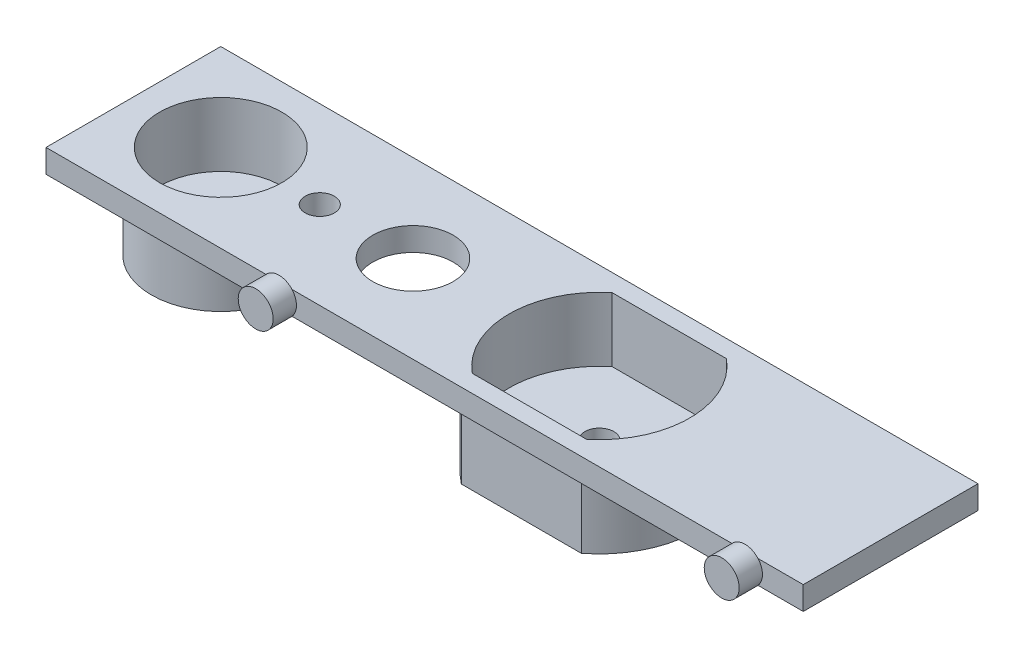
ISO-10303-21;
HEADER;
FILE_DESCRIPTION(('STEP AP214'),'2;1');
FILE_NAME('part.step','',(''),(''),'','','');
FILE_SCHEMA(('AUTOMOTIVE_DESIGN { 1 0 10303 214 1 1 1 1 }'));
ENDSEC;
DATA;
#1=APPLICATION_CONTEXT('core data for automotive mechanical design processes');
#2=APPLICATION_PROTOCOL_DEFINITION('international standard','automotive_design',2000,#1);
#3=PRODUCT_CONTEXT('',#1,'mechanical');
#4=PRODUCT('Part','Part','',(#3));
#5=PRODUCT_RELATED_PRODUCT_CATEGORY('part','',(#4));
#6=PRODUCT_DEFINITION_FORMATION('','',#4);
#7=PRODUCT_DEFINITION_CONTEXT('part definition',#1,'design');
#8=PRODUCT_DEFINITION('design','',#6,#7);
#9=PRODUCT_DEFINITION_SHAPE('','',#8);
#10=(LENGTH_UNIT() NAMED_UNIT(*) SI_UNIT(.MILLI.,.METRE.));
#11=(NAMED_UNIT(*) PLANE_ANGLE_UNIT() SI_UNIT($,.RADIAN.));
#12=(NAMED_UNIT(*) SI_UNIT($,.STERADIAN.) SOLID_ANGLE_UNIT());
#13=UNCERTAINTY_MEASURE_WITH_UNIT(LENGTH_MEASURE(1.E-05),#10,'distance_accuracy_value','');
#14=(GEOMETRIC_REPRESENTATION_CONTEXT(3) GLOBAL_UNCERTAINTY_ASSIGNED_CONTEXT((#13)) GLOBAL_UNIT_ASSIGNED_CONTEXT((#10,
#11,#12)) REPRESENTATION_CONTEXT('',''));
#15=CARTESIAN_POINT('',(0.,0.,0.));
#16=DIRECTION('',(0.,0.,1.));
#17=DIRECTION('',(1.,0.,0.));
#18=AXIS2_PLACEMENT_3D('',#15,#16,#17);
#19=CARTESIAN_POINT('',(0.,2.,0.));
#20=DIRECTION('',(0.,1.,0.));
#21=DIRECTION('',(0.,0.,1.));
#22=AXIS2_PLACEMENT_3D('',#19,#20,#21);
#23=PLANE('',#22);
#24=CARTESIAN_POINT('',(-32.5,2.,0.));
#25=DIRECTION('',(0.,1.,0.));
#26=DIRECTION('',(0.,0.,1.));
#27=AXIS2_PLACEMENT_3D('',#24,#25,#26);
#28=CIRCLE('',#27,5.25);
#29=CARTESIAN_POINT('',(-32.5,2.,5.25));
#30=VERTEX_POINT('',#29);
#31=EDGE_CURVE('E618',#30,#30,#28,.T.);
#32=ORIENTED_EDGE('',*,*,#31,.F.);
#33=EDGE_LOOP('',(#32));
#34=FACE_BOUND('',#33,.T.);
#35=CARTESIAN_POINT('',(-24.,2.,0.));
#36=DIRECTION('',(0.,1.,0.));
#37=DIRECTION('',(0.,0.,1.));
#38=AXIS2_PLACEMENT_3D('',#35,#36,#37);
#39=CIRCLE('',#38,1.25);
#40=CARTESIAN_POINT('',(-24.,2.,1.25000000000001));
#41=VERTEX_POINT('',#40);
#42=EDGE_CURVE('E361',#41,#41,#39,.F.);
#43=ORIENTED_EDGE('',*,*,#42,.T.);
#44=EDGE_LOOP('',(#43));
#45=FACE_BOUND('',#44,.T.);
#46=CARTESIAN_POINT('',(-16.,2.,0.));
#47=DIRECTION('',(0.,1.,0.));
#48=DIRECTION('',(0.,0.,1.));
#49=AXIS2_PLACEMENT_3D('',#46,#47,#48);
#50=CIRCLE('',#49,3.45);
#51=CARTESIAN_POINT('',(-16.,2.,3.45));
#52=VERTEX_POINT('',#51);
#53=EDGE_CURVE('E347',#52,#52,#50,.F.);
#54=ORIENTED_EDGE('',*,*,#53,.T.);
#55=EDGE_LOOP('',(#54));
#56=FACE_BOUND('',#55,.T.);
#57=DIRECTION('',(0.,0.,-1.));
#58=VECTOR('',#57,1.);
#59=CARTESIAN_POINT('',(-40.,2.,0.));
#60=LINE('',#59,#58);
#61=CARTESIAN_POINT('',(-40.,2.,7.5));
#62=VERTEX_POINT('',#61);
#63=CARTESIAN_POINT('',(-40.,2.,-7.5));
#64=VERTEX_POINT('',#63);
#65=EDGE_CURVE('E377',#62,#64,#60,.T.);
#66=ORIENTED_EDGE('',*,*,#65,.F.);
#67=DIRECTION('',(-1.,0.,0.));
#68=VECTOR('',#67,1.);
#69=CARTESIAN_POINT('',(0.,2.,7.5));
#70=LINE('',#69,#68);
#71=CARTESIAN_POINT('',(-21.1180339887499,2.,7.5));
#72=VERTEX_POINT('',#71);
#73=EDGE_CURVE('E381',#72,#62,#70,.T.);
#74=ORIENTED_EDGE('',*,*,#73,.F.);
#75=CARTESIAN_POINT('',(-18.8819660112501,2.,7.5));
#76=VERTEX_POINT('',#75);
#77=EDGE_CURVE('E478',#76,#72,#70,.T.);
#78=ORIENTED_EDGE('',*,*,#77,.F.);
#79=CARTESIAN_POINT('',(18.8819660112501,2.,7.5));
#80=VERTEX_POINT('',#79);
#81=EDGE_CURVE('E480',#80,#76,#70,.T.);
#82=ORIENTED_EDGE('',*,*,#81,.F.);
#83=CARTESIAN_POINT('',(21.1180339887499,2.,7.5));
#84=VERTEX_POINT('',#83);
#85=EDGE_CURVE('E387',#84,#80,#70,.T.);
#86=ORIENTED_EDGE('',*,*,#85,.F.);
#87=CARTESIAN_POINT('',(25.,2.,7.5));
#88=VERTEX_POINT('',#87);
#89=EDGE_CURVE('E383',#88,#84,#70,.T.);
#90=ORIENTED_EDGE('',*,*,#89,.F.);
#91=DIRECTION('',(0.,0.,1.));
#92=VECTOR('',#91,1.);
#93=CARTESIAN_POINT('',(25.,2.,-7.5));
#94=LINE('',#93,#92);
#95=CARTESIAN_POINT('',(25.,2.,-7.5));
#96=VERTEX_POINT('',#95);
#97=EDGE_CURVE('E410',#96,#88,#94,.T.);
#98=ORIENTED_EDGE('',*,*,#97,.F.);
#99=DIRECTION('',(-1.,0.,0.));
#100=VECTOR('',#99,1.);
#101=CARTESIAN_POINT('',(0.,2.,-7.5));
#102=LINE('',#101,#100);
#103=EDGE_CURVE('E386',#96,#64,#102,.T.);
#104=ORIENTED_EDGE('',*,*,#103,.T.);
#105=EDGE_LOOP('',(#66,#74,#78,#82,#86,#90,#98,#104));
#106=FACE_BOUND('',#105,.T.);
#107=CARTESIAN_POINT('',(0.,2.,0.));
#108=DIRECTION('',(0.,1.,0.));
#109=DIRECTION('',(0.,0.,1.));
#110=AXIS2_PLACEMENT_3D('',#107,#108,#109);
#111=CIRCLE('',#110,7.75);
#112=CARTESIAN_POINT('',(4.90535421758714,2.,6.));
#113=VERTEX_POINT('',#112);
#114=CARTESIAN_POINT('',(4.90535421758714,2.,-6.));
#115=VERTEX_POINT('',#114);
#116=EDGE_CURVE('E279',#113,#115,#111,.T.);
#117=ORIENTED_EDGE('',*,*,#116,.F.);
#118=DIRECTION('',(-1.,0.,0.));
#119=VECTOR('',#118,1.);
#120=CARTESIAN_POINT('',(0.,2.,6.));
#121=LINE('',#120,#119);
#122=CARTESIAN_POINT('',(-4.90535421758714,2.,6.));
#123=VERTEX_POINT('',#122);
#124=EDGE_CURVE('E145',#113,#123,#121,.T.);
#125=ORIENTED_EDGE('',*,*,#124,.T.);
#126=CARTESIAN_POINT('',(0.,2.,0.));
#127=DIRECTION('',(0.,1.,0.));
#128=DIRECTION('',(0.,0.,1.));
#129=AXIS2_PLACEMENT_3D('',#126,#127,#128);
#130=CIRCLE('',#129,7.75);
#131=CARTESIAN_POINT('',(-4.90535421758714,2.,-6.));
#132=VERTEX_POINT('',#131);
#133=EDGE_CURVE('E265',#132,#123,#130,.T.);
#134=ORIENTED_EDGE('',*,*,#133,.F.);
#135=DIRECTION('',(-1.,0.,0.));
#136=VECTOR('',#135,1.);
#137=CARTESIAN_POINT('',(0.,2.,-6.));
#138=LINE('',#137,#136);
#139=EDGE_CURVE('E627',#115,#132,#138,.T.);
#140=ORIENTED_EDGE('',*,*,#139,.F.);
#141=EDGE_LOOP('',(#117,#125,#134,#140));
#142=FACE_BOUND('',#141,.T.);
#143=ADVANCED_FACE('F126',(#34,#45,#56,#106,#142),#23,.T.);
#144=CARTESIAN_POINT('',(0.,11.7580735803744,0.));
#145=DIRECTION('',(0.,-1.,0.));
#146=DIRECTION('',(0.,0.,-1.));
#147=AXIS2_PLACEMENT_3D('',#144,#145,#146);
#148=CYLINDRICAL_SURFACE('',#147,1.25);
#149=CARTESIAN_POINT('',(0.,-6.,0.));
#150=DIRECTION('',(0.,1.,0.));
#151=DIRECTION('',(0.,0.,1.));
#152=AXIS2_PLACEMENT_3D('',#149,#150,#151);
#153=CIRCLE('',#152,1.25);
#154=CARTESIAN_POINT('',(0.,-6.,1.25));
#155=VERTEX_POINT('',#154);
#156=EDGE_CURVE('E287',#155,#155,#153,.T.);
#157=ORIENTED_EDGE('',*,*,#156,.F.);
#158=EDGE_LOOP('',(#157));
#159=FACE_BOUND('',#158,.T.);
#160=CARTESIAN_POINT('',(0.,-3.5,0.));
#161=DIRECTION('',(0.,1.,0.));
#162=DIRECTION('',(0.,0.,1.));
#163=AXIS2_PLACEMENT_3D('',#160,#161,#162);
#164=CIRCLE('',#163,1.25);
#165=CARTESIAN_POINT('',(0.,-3.5,1.25));
#166=VERTEX_POINT('',#165);
#167=EDGE_CURVE('E261',#166,#166,#164,.T.);
#168=ORIENTED_EDGE('',*,*,#167,.T.);
#169=EDGE_LOOP('',(#168));
#170=FACE_BOUND('',#169,.T.);
#171=ADVANCED_FACE('F511',(#159,#170),#148,.F.);
#172=CARTESIAN_POINT('',(0.,0.,0.));
#173=DIRECTION('',(0.,1.,0.));
#174=DIRECTION('',(0.,0.,1.));
#175=AXIS2_PLACEMENT_3D('',#172,#173,#174);
#176=PLANE('',#175);
#177=CARTESIAN_POINT('',(-32.5,0.,0.));
#178=DIRECTION('',(0.,1.,0.));
#179=DIRECTION('',(0.,0.,1.));
#180=AXIS2_PLACEMENT_3D('',#177,#178,#179);
#181=CIRCLE('',#180,5.95);
#182=CARTESIAN_POINT('',(-32.5,0.,5.95));
#183=VERTEX_POINT('',#182);
#184=EDGE_CURVE('E339',#183,#183,#181,.T.);
#185=ORIENTED_EDGE('',*,*,#184,.T.);
#186=EDGE_LOOP('',(#185));
#187=FACE_BOUND('',#186,.T.);
#188=CARTESIAN_POINT('',(-24.,0.,0.));
#189=DIRECTION('',(0.,-1.,0.));
#190=DIRECTION('',(0.,0.,-1.));
#191=AXIS2_PLACEMENT_3D('',#188,#189,#190);
#192=CIRCLE('',#191,1.25);
#193=CARTESIAN_POINT('',(-24.,0.,-1.25));
#194=VERTEX_POINT('',#193);
#195=EDGE_CURVE('E365',#194,#194,#192,.T.);
#196=ORIENTED_EDGE('',*,*,#195,.F.);
#197=EDGE_LOOP('',(#196));
#198=FACE_BOUND('',#197,.T.);
#199=DIRECTION('',(0.,0.,-1.));
#200=VECTOR('',#199,1.);
#201=CARTESIAN_POINT('',(-40.,0.,0.));
#202=LINE('',#201,#200);
#203=CARTESIAN_POINT('',(-40.,0.,7.5));
#204=VERTEX_POINT('',#203);
#205=CARTESIAN_POINT('',(-40.,0.,-7.5));
#206=VERTEX_POINT('',#205);
#207=EDGE_CURVE('E391',#204,#206,#202,.T.);
#208=ORIENTED_EDGE('',*,*,#207,.T.);
#209=DIRECTION('',(-1.,0.,0.));
#210=VECTOR('',#209,1.);
#211=CARTESIAN_POINT('',(0.,0.,-7.5));
#212=LINE('',#211,#210);
#213=CARTESIAN_POINT('',(25.,0.,-7.5));
#214=VERTEX_POINT('',#213);
#215=EDGE_CURVE('E382',#214,#206,#212,.T.);
#216=ORIENTED_EDGE('',*,*,#215,.F.);
#217=DIRECTION('',(0.,0.,1.));
#218=VECTOR('',#217,1.);
#219=CARTESIAN_POINT('',(25.,0.,-7.5));
#220=LINE('',#219,#218);
#221=CARTESIAN_POINT('',(25.,0.,7.5));
#222=VERTEX_POINT('',#221);
#223=EDGE_CURVE('E370',#214,#222,#220,.T.);
#224=ORIENTED_EDGE('',*,*,#223,.T.);
#225=DIRECTION('',(-1.,0.,0.));
#226=VECTOR('',#225,1.);
#227=CARTESIAN_POINT('',(0.,0.,7.5));
#228=LINE('',#227,#226);
#229=CARTESIAN_POINT('',(21.1180339887499,0.,7.5));
#230=VERTEX_POINT('',#229);
#231=EDGE_CURVE('E396',#222,#230,#228,.T.);
#232=ORIENTED_EDGE('',*,*,#231,.T.);
#233=CARTESIAN_POINT('',(18.8819660112501,0.,7.5));
#234=VERTEX_POINT('',#233);
#235=EDGE_CURVE('E400',#230,#234,#228,.T.);
#236=ORIENTED_EDGE('',*,*,#235,.T.);
#237=CARTESIAN_POINT('',(-18.8819660112501,0.,7.5));
#238=VERTEX_POINT('',#237);
#239=EDGE_CURVE('E472',#234,#238,#228,.T.);
#240=ORIENTED_EDGE('',*,*,#239,.T.);
#241=CARTESIAN_POINT('',(-21.1180339887499,0.,7.5));
#242=VERTEX_POINT('',#241);
#243=EDGE_CURVE('E469',#238,#242,#228,.T.);
#244=ORIENTED_EDGE('',*,*,#243,.T.);
#245=EDGE_CURVE('E395',#242,#204,#228,.T.);
#246=ORIENTED_EDGE('',*,*,#245,.T.);
#247=EDGE_LOOP('',(#208,#216,#224,#232,#236,#240,#244,#246));
#248=FACE_BOUND('',#247,.T.);
#249=CARTESIAN_POINT('',(-16.,0.,0.));
#250=DIRECTION('',(0.,-1.,0.));
#251=DIRECTION('',(0.,0.,-1.));
#252=AXIS2_PLACEMENT_3D('',#249,#250,#251);
#253=CIRCLE('',#252,3.45);
#254=CARTESIAN_POINT('',(-16.,0.,-3.45));
#255=VERTEX_POINT('',#254);
#256=EDGE_CURVE('E366',#255,#255,#253,.T.);
#257=ORIENTED_EDGE('',*,*,#256,.F.);
#258=EDGE_LOOP('',(#257));
#259=FACE_BOUND('',#258,.T.);
#260=DIRECTION('',(-1.,0.,0.));
#261=VECTOR('',#260,1.);
#262=CARTESIAN_POINT('',(0.,0.,6.7));
#263=LINE('',#262,#261);
#264=CARTESIAN_POINT('',(5.14902903468217,0.,6.7));
#265=VERTEX_POINT('',#264);
#266=CARTESIAN_POINT('',(-5.14902903468217,0.,6.7));
#267=VERTEX_POINT('',#266);
#268=EDGE_CURVE('E336',#265,#267,#263,.T.);
#269=ORIENTED_EDGE('',*,*,#268,.F.);
#270=CARTESIAN_POINT('',(0.,0.,0.));
#271=DIRECTION('',(0.,1.,0.));
#272=DIRECTION('',(0.,0.,1.));
#273=AXIS2_PLACEMENT_3D('',#270,#271,#272);
#274=CIRCLE('',#273,8.45);
#275=CARTESIAN_POINT('',(5.14902903468217,0.,-6.7));
#276=VERTEX_POINT('',#275);
#277=EDGE_CURVE('E297',#265,#276,#274,.T.);
#278=ORIENTED_EDGE('',*,*,#277,.T.);
#279=DIRECTION('',(-1.,0.,0.));
#280=VECTOR('',#279,1.);
#281=CARTESIAN_POINT('',(0.,0.,-6.7));
#282=LINE('',#281,#280);
#283=CARTESIAN_POINT('',(-5.14902903468217,0.,-6.7));
#284=VERTEX_POINT('',#283);
#285=EDGE_CURVE('E328',#276,#284,#282,.T.);
#286=ORIENTED_EDGE('',*,*,#285,.T.);
#287=CARTESIAN_POINT('',(0.,0.,0.));
#288=DIRECTION('',(0.,1.,0.));
#289=DIRECTION('',(0.,0.,1.));
#290=AXIS2_PLACEMENT_3D('',#287,#288,#289);
#291=CIRCLE('',#290,8.45);
#292=EDGE_CURVE('E332',#284,#267,#291,.T.);
#293=ORIENTED_EDGE('',*,*,#292,.T.);
#294=EDGE_LOOP('',(#269,#278,#286,#293));
#295=FACE_BOUND('',#294,.T.);
#296=ADVANCED_FACE('F429',(#187,#198,#248,#259,#295),#176,.F.);
#297=CARTESIAN_POINT('',(0.,2.,7.5));
#298=DIRECTION('',(0.,0.,1.));
#299=DIRECTION('',(1.,0.,0.));
#300=AXIS2_PLACEMENT_3D('',#297,#298,#299);
#301=PLANE('',#300);
#302=CARTESIAN_POINT('',(20.,0.999999999999999,7.5));
#303=DIRECTION('',(0.,0.,1.));
#304=DIRECTION('',(1.,0.,0.));
#305=AXIS2_PLACEMENT_3D('',#302,#303,#304);
#306=CIRCLE('',#305,1.5);
#307=EDGE_CURVE('E13',#80,#234,#306,.T.);
#308=ORIENTED_EDGE('',*,*,#307,.F.);
#309=ORIENTED_EDGE('',*,*,#81,.T.);
#310=CARTESIAN_POINT('',(-20.,0.999999999999995,7.5));
#311=DIRECTION('',(0.,0.,1.));
#312=DIRECTION('',(1.,0.,0.));
#313=AXIS2_PLACEMENT_3D('',#310,#311,#312);
#314=CIRCLE('',#313,1.5);
#315=EDGE_CURVE('E357',#238,#76,#314,.T.);
#316=ORIENTED_EDGE('',*,*,#315,.F.);
#317=ORIENTED_EDGE('',*,*,#239,.F.);
#318=EDGE_LOOP('',(#308,#309,#316,#317));
#319=FACE_BOUND('',#318,.T.);
#320=ADVANCED_FACE('F489',(#319),#301,.T.);
#321=EDGE_CURVE('E454',#72,#242,#314,.T.);
#322=ORIENTED_EDGE('',*,*,#321,.F.);
#323=ORIENTED_EDGE('',*,*,#73,.T.);
#324=DIRECTION('',(0.,-1.,0.));
#325=VECTOR('',#324,1.);
#326=CARTESIAN_POINT('',(-40.,2.,7.5));
#327=LINE('',#326,#325);
#328=EDGE_CURVE('E406',#62,#204,#327,.T.);
#329=ORIENTED_EDGE('',*,*,#328,.T.);
#330=ORIENTED_EDGE('',*,*,#245,.F.);
#331=EDGE_LOOP('',(#322,#323,#329,#330));
#332=FACE_BOUND('',#331,.T.);
#333=ADVANCED_FACE('F476',(#332),#301,.T.);
#334=CARTESIAN_POINT('',(0.,2.,-7.5));
#335=DIRECTION('',(0.,0.,1.));
#336=DIRECTION('',(1.,0.,0.));
#337=AXIS2_PLACEMENT_3D('',#334,#335,#336);
#338=PLANE('',#337);
#339=ORIENTED_EDGE('',*,*,#215,.T.);
#340=DIRECTION('',(0.,-1.,0.));
#341=VECTOR('',#340,1.);
#342=CARTESIAN_POINT('',(-40.,2.,-7.5));
#343=LINE('',#342,#341);
#344=EDGE_CURVE('E390',#64,#206,#343,.T.);
#345=ORIENTED_EDGE('',*,*,#344,.F.);
#346=ORIENTED_EDGE('',*,*,#103,.F.);
#347=DIRECTION('',(0.,-1.,0.));
#348=VECTOR('',#347,1.);
#349=CARTESIAN_POINT('',(25.,2.,-7.5));
#350=LINE('',#349,#348);
#351=EDGE_CURVE('E414',#96,#214,#350,.T.);
#352=ORIENTED_EDGE('',*,*,#351,.T.);
#353=EDGE_LOOP('',(#339,#345,#346,#352));
#354=FACE_BOUND('',#353,.T.);
#355=ADVANCED_FACE('F435',(#354),#338,.F.);
#356=EDGE_CURVE('E136',#230,#84,#306,.T.);
#357=ORIENTED_EDGE('',*,*,#356,.F.);
#358=ORIENTED_EDGE('',*,*,#231,.F.);
#359=DIRECTION('',(0.,-1.,0.));
#360=VECTOR('',#359,1.);
#361=CARTESIAN_POINT('',(25.,2.,7.5));
#362=LINE('',#361,#360);
#363=EDGE_CURVE('E130',#88,#222,#362,.T.);
#364=ORIENTED_EDGE('',*,*,#363,.F.);
#365=ORIENTED_EDGE('',*,*,#89,.T.);
#366=EDGE_LOOP('',(#357,#358,#364,#365));
#367=FACE_BOUND('',#366,.T.);
#368=ADVANCED_FACE('F449',(#367),#301,.T.);
#369=CARTESIAN_POINT('',(-40.,2.,0.));
#370=DIRECTION('',(-1.,0.,0.));
#371=DIRECTION('',(0.,0.,1.));
#372=AXIS2_PLACEMENT_3D('',#369,#370,#371);
#373=PLANE('',#372);
#374=ORIENTED_EDGE('',*,*,#207,.F.);
#375=ORIENTED_EDGE('',*,*,#328,.F.);
#376=ORIENTED_EDGE('',*,*,#65,.T.);
#377=ORIENTED_EDGE('',*,*,#344,.T.);
#378=EDGE_LOOP('',(#374,#375,#376,#377));
#379=FACE_BOUND('',#378,.T.);
#380=ADVANCED_FACE('F439',(#379),#373,.T.);
#381=CARTESIAN_POINT('',(25.,2.,-7.5));
#382=DIRECTION('',(1.,0.,0.));
#383=DIRECTION('',(0.,0.,-1.));
#384=AXIS2_PLACEMENT_3D('',#381,#382,#383);
#385=PLANE('',#384);
#386=ORIENTED_EDGE('',*,*,#223,.F.);
#387=ORIENTED_EDGE('',*,*,#351,.F.);
#388=ORIENTED_EDGE('',*,*,#97,.T.);
#389=ORIENTED_EDGE('',*,*,#363,.T.);
#390=EDGE_LOOP('',(#386,#387,#388,#389));
#391=FACE_BOUND('',#390,.T.);
#392=ADVANCED_FACE('F128',(#391),#385,.T.);
#393=CARTESIAN_POINT('',(-16.,11.7580735803744,0.));
#394=DIRECTION('',(0.,-1.,0.));
#395=DIRECTION('',(0.,0.,-1.));
#396=AXIS2_PLACEMENT_3D('',#393,#394,#395);
#397=CYLINDRICAL_SURFACE('',#396,3.45);
#398=ORIENTED_EDGE('',*,*,#256,.T.);
#399=EDGE_LOOP('',(#398));
#400=FACE_BOUND('',#399,.T.);
#401=ORIENTED_EDGE('',*,*,#53,.F.);
#402=EDGE_LOOP('',(#401));
#403=FACE_BOUND('',#402,.T.);
#404=ADVANCED_FACE('F524',(#400,#403),#397,.F.);
#405=CARTESIAN_POINT('',(-24.,11.7580735803744,0.));
#406=DIRECTION('',(0.,-1.,0.));
#407=DIRECTION('',(0.,0.,-1.));
#408=AXIS2_PLACEMENT_3D('',#405,#406,#407);
#409=CYLINDRICAL_SURFACE('',#408,1.25);
#410=ORIENTED_EDGE('',*,*,#195,.T.);
#411=EDGE_LOOP('',(#410));
#412=FACE_BOUND('',#411,.T.);
#413=ORIENTED_EDGE('',*,*,#42,.F.);
#414=EDGE_LOOP('',(#413));
#415=FACE_BOUND('',#414,.T.);
#416=ADVANCED_FACE('F536',(#412,#415),#409,.F.);
#417=CARTESIAN_POINT('',(-20.,0.999999999999995,7.5));
#418=DIRECTION('',(0.,0.,1.));
#419=DIRECTION('',(1.,0.,0.));
#420=AXIS2_PLACEMENT_3D('',#417,#418,#419);
#421=PLANE('',#420);
#422=EDGE_CURVE('E352',#76,#72,#314,.T.);
#423=ORIENTED_EDGE('',*,*,#422,.F.);
#424=ORIENTED_EDGE('',*,*,#77,.T.);
#425=EDGE_LOOP('',(#423,#424));
#426=FACE_BOUND('',#425,.T.);
#427=ADVANCED_FACE('F541',(#426),#421,.F.);
#428=CARTESIAN_POINT('',(-20.,0.999999999999995,9.5));
#429=DIRECTION('',(0.,0.,-1.));
#430=DIRECTION('',(-1.,0.,0.));
#431=AXIS2_PLACEMENT_3D('',#428,#429,#430);
#432=CYLINDRICAL_SURFACE('',#431,1.5);
#433=CARTESIAN_POINT('',(-20.,0.999999999999995,9.5));
#434=DIRECTION('',(0.,0.,1.));
#435=DIRECTION('',(1.,0.,0.));
#436=AXIS2_PLACEMENT_3D('',#433,#434,#435);
#437=CIRCLE('',#436,1.5);
#438=CARTESIAN_POINT('',(-18.5,0.999999999999995,9.5));
#439=VERTEX_POINT('',#438);
#440=EDGE_CURVE('E343',#439,#439,#437,.T.);
#441=ORIENTED_EDGE('',*,*,#440,.F.);
#442=EDGE_LOOP('',(#441));
#443=FACE_BOUND('',#442,.T.);
#444=ORIENTED_EDGE('',*,*,#422,.T.);
#445=ORIENTED_EDGE('',*,*,#321,.T.);
#446=EDGE_CURVE('E356',#242,#238,#314,.T.);
#447=ORIENTED_EDGE('',*,*,#446,.T.);
#448=ORIENTED_EDGE('',*,*,#315,.T.);
#449=EDGE_LOOP('',(#444,#445,#447,#448));
#450=FACE_BOUND('',#449,.T.);
#451=ADVANCED_FACE('F463',(#443,#450),#432,.T.);
#452=CARTESIAN_POINT('',(-20.,0.999999999999995,9.5));
#453=DIRECTION('',(0.,0.,1.));
#454=DIRECTION('',(1.,0.,0.));
#455=AXIS2_PLACEMENT_3D('',#452,#453,#454);
#456=PLANE('',#455);
#457=ORIENTED_EDGE('',*,*,#440,.T.);
#458=EDGE_LOOP('',(#457));
#459=FACE_BOUND('',#458,.T.);
#460=ADVANCED_FACE('F783',(#459),#456,.T.);
#461=ORIENTED_EDGE('',*,*,#243,.F.);
#462=ORIENTED_EDGE('',*,*,#446,.F.);
#463=EDGE_LOOP('',(#461,#462));
#464=FACE_BOUND('',#463,.T.);
#465=ADVANCED_FACE('F467',(#464),#421,.F.);
#466=CARTESIAN_POINT('',(20.,0.999999999999999,7.5));
#467=DIRECTION('',(0.,0.,1.));
#468=DIRECTION('',(1.,0.,0.));
#469=AXIS2_PLACEMENT_3D('',#466,#467,#468);
#470=PLANE('',#469);
#471=EDGE_CURVE('E348',#84,#80,#306,.T.);
#472=ORIENTED_EDGE('',*,*,#471,.F.);
#473=ORIENTED_EDGE('',*,*,#85,.T.);
#474=EDGE_LOOP('',(#472,#473));
#475=FACE_BOUND('',#474,.T.);
#476=ADVANCED_FACE('F486',(#475),#470,.F.);
#477=CARTESIAN_POINT('',(20.,0.999999999999999,9.5));
#478=DIRECTION('',(0.,0.,-1.));
#479=DIRECTION('',(-1.,0.,0.));
#480=AXIS2_PLACEMENT_3D('',#477,#478,#479);
#481=CYLINDRICAL_SURFACE('',#480,1.5);
#482=CARTESIAN_POINT('',(20.,0.999999999999999,9.5));
#483=DIRECTION('',(0.,0.,1.));
#484=DIRECTION('',(1.,0.,0.));
#485=AXIS2_PLACEMENT_3D('',#482,#483,#484);
#486=CIRCLE('',#485,1.5);
#487=CARTESIAN_POINT('',(21.5,0.999999999999999,9.5));
#488=VERTEX_POINT('',#487);
#489=EDGE_CURVE('E344',#488,#488,#486,.T.);
#490=ORIENTED_EDGE('',*,*,#489,.F.);
#491=EDGE_LOOP('',(#490));
#492=FACE_BOUND('',#491,.T.);
#493=ORIENTED_EDGE('',*,*,#471,.T.);
#494=ORIENTED_EDGE('',*,*,#307,.T.);
#495=EDGE_CURVE('E138',#234,#230,#306,.T.);
#496=ORIENTED_EDGE('',*,*,#495,.T.);
#497=ORIENTED_EDGE('',*,*,#356,.T.);
#498=EDGE_LOOP('',(#493,#494,#496,#497));
#499=FACE_BOUND('',#498,.T.);
#500=ADVANCED_FACE('F487',(#492,#499),#481,.T.);
#501=CARTESIAN_POINT('',(20.,0.999999999999999,9.5));
#502=DIRECTION('',(0.,0.,1.));
#503=DIRECTION('',(1.,0.,0.));
#504=AXIS2_PLACEMENT_3D('',#501,#502,#503);
#505=PLANE('',#504);
#506=ORIENTED_EDGE('',*,*,#489,.T.);
#507=EDGE_LOOP('',(#506));
#508=FACE_BOUND('',#507,.T.);
#509=ADVANCED_FACE('F496',(#508),#505,.T.);
#510=ORIENTED_EDGE('',*,*,#235,.F.);
#511=ORIENTED_EDGE('',*,*,#495,.F.);
#512=EDGE_LOOP('',(#510,#511));
#513=FACE_BOUND('',#512,.T.);
#514=ADVANCED_FACE('F492',(#513),#470,.F.);
#515=CARTESIAN_POINT('',(0.,-6.,6.7));
#516=DIRECTION('',(0.,0.,-1.));
#517=DIRECTION('',(-1.,0.,0.));
#518=AXIS2_PLACEMENT_3D('',#515,#516,#517);
#519=PLANE('',#518);
#520=DIRECTION('',(0.,1.,0.));
#521=VECTOR('',#520,1.);
#522=CARTESIAN_POINT('',(5.14902903468217,-6.,6.7));
#523=LINE('',#522,#521);
#524=CARTESIAN_POINT('',(5.14902903468217,-6.,6.7));
#525=VERTEX_POINT('',#524);
#526=EDGE_CURVE('E312',#525,#265,#523,.T.);
#527=ORIENTED_EDGE('',*,*,#526,.T.);
#528=ORIENTED_EDGE('',*,*,#268,.T.);
#529=DIRECTION('',(0.,1.,0.));
#530=VECTOR('',#529,1.);
#531=CARTESIAN_POINT('',(-5.14902903468217,-6.,6.7));
#532=LINE('',#531,#530);
#533=CARTESIAN_POINT('',(-5.14902903468217,-6.,6.7));
#534=VERTEX_POINT('',#533);
#535=EDGE_CURVE('E298',#534,#267,#532,.T.);
#536=ORIENTED_EDGE('',*,*,#535,.F.);
#537=DIRECTION('',(-1.,0.,0.));
#538=VECTOR('',#537,1.);
#539=CARTESIAN_POINT('',(0.,-6.,6.7));
#540=LINE('',#539,#538);
#541=EDGE_CURVE('E291',#525,#534,#540,.T.);
#542=ORIENTED_EDGE('',*,*,#541,.F.);
#543=EDGE_LOOP('',(#527,#528,#536,#542));
#544=FACE_BOUND('',#543,.T.);
#545=ADVANCED_FACE('F495',(#544),#519,.F.);
#546=CARTESIAN_POINT('',(0.,-6.,0.));
#547=DIRECTION('',(0.,1.,0.));
#548=DIRECTION('',(0.,0.,1.));
#549=AXIS2_PLACEMENT_3D('',#546,#547,#548);
#550=CYLINDRICAL_SURFACE('',#549,8.45);
#551=ORIENTED_EDGE('',*,*,#292,.F.);
#552=DIRECTION('',(0.,1.,0.));
#553=VECTOR('',#552,1.);
#554=CARTESIAN_POINT('',(-5.14902903468217,-6.,-6.7));
#555=LINE('',#554,#553);
#556=CARTESIAN_POINT('',(-5.14902903468217,-6.,-6.7));
#557=VERTEX_POINT('',#556);
#558=EDGE_CURVE('E316',#557,#284,#555,.T.);
#559=ORIENTED_EDGE('',*,*,#558,.F.);
#560=CARTESIAN_POINT('',(0.,-6.,0.));
#561=DIRECTION('',(0.,1.,0.));
#562=DIRECTION('',(0.,0.,1.));
#563=AXIS2_PLACEMENT_3D('',#560,#561,#562);
#564=CIRCLE('',#563,8.45);
#565=EDGE_CURVE('E308',#557,#534,#564,.T.);
#566=ORIENTED_EDGE('',*,*,#565,.T.);
#567=ORIENTED_EDGE('',*,*,#535,.T.);
#568=EDGE_LOOP('',(#551,#559,#566,#567));
#569=FACE_BOUND('',#568,.T.);
#570=ADVANCED_FACE('F503',(#569),#550,.T.);
#571=CARTESIAN_POINT('',(0.,-6.,-6.7));
#572=DIRECTION('',(0.,0.,-1.));
#573=DIRECTION('',(-1.,0.,0.));
#574=AXIS2_PLACEMENT_3D('',#571,#572,#573);
#575=PLANE('',#574);
#576=ORIENTED_EDGE('',*,*,#285,.F.);
#577=DIRECTION('',(0.,1.,0.));
#578=VECTOR('',#577,1.);
#579=CARTESIAN_POINT('',(5.14902903468217,-6.,-6.7));
#580=LINE('',#579,#578);
#581=CARTESIAN_POINT('',(5.14902903468217,-6.,-6.7));
#582=VERTEX_POINT('',#581);
#583=EDGE_CURVE('E153',#582,#276,#580,.T.);
#584=ORIENTED_EDGE('',*,*,#583,.F.);
#585=DIRECTION('',(-1.,0.,0.));
#586=VECTOR('',#585,1.);
#587=CARTESIAN_POINT('',(0.,-6.,-6.7));
#588=LINE('',#587,#586);
#589=EDGE_CURVE('E304',#582,#557,#588,.T.);
#590=ORIENTED_EDGE('',*,*,#589,.T.);
#591=ORIENTED_EDGE('',*,*,#558,.T.);
#592=EDGE_LOOP('',(#576,#584,#590,#591));
#593=FACE_BOUND('',#592,.T.);
#594=ADVANCED_FACE('F560',(#593),#575,.T.);
#595=CARTESIAN_POINT('',(0.,-6.,0.));
#596=DIRECTION('',(0.,1.,0.));
#597=DIRECTION('',(0.,0.,1.));
#598=AXIS2_PLACEMENT_3D('',#595,#596,#597);
#599=CYLINDRICAL_SURFACE('',#598,8.45);
#600=ORIENTED_EDGE('',*,*,#277,.F.);
#601=ORIENTED_EDGE('',*,*,#526,.F.);
#602=CARTESIAN_POINT('',(0.,-6.,0.));
#603=DIRECTION('',(0.,1.,0.));
#604=DIRECTION('',(0.,0.,1.));
#605=AXIS2_PLACEMENT_3D('',#602,#603,#604);
#606=CIRCLE('',#605,8.45);
#607=EDGE_CURVE('E301',#525,#582,#606,.T.);
#608=ORIENTED_EDGE('',*,*,#607,.T.);
#609=ORIENTED_EDGE('',*,*,#583,.T.);
#610=EDGE_LOOP('',(#600,#601,#608,#609));
#611=FACE_BOUND('',#610,.T.);
#612=ADVANCED_FACE('F558',(#611),#599,.T.);
#613=CARTESIAN_POINT('',(0.,-6.,0.));
#614=DIRECTION('',(0.,1.,0.));
#615=DIRECTION('',(0.,0.,1.));
#616=AXIS2_PLACEMENT_3D('',#613,#614,#615);
#617=PLANE('',#616);
#618=ORIENTED_EDGE('',*,*,#541,.T.);
#619=ORIENTED_EDGE('',*,*,#565,.F.);
#620=ORIENTED_EDGE('',*,*,#589,.F.);
#621=ORIENTED_EDGE('',*,*,#607,.F.);
#622=EDGE_LOOP('',(#618,#619,#620,#621));
#623=FACE_BOUND('',#622,.T.);
#624=ORIENTED_EDGE('',*,*,#156,.T.);
#625=EDGE_LOOP('',(#624));
#626=FACE_BOUND('',#625,.T.);
#627=ADVANCED_FACE('F555',(#623,#626),#617,.F.);
#628=CARTESIAN_POINT('',(-32.5,-6.,0.));
#629=DIRECTION('',(0.,1.,0.));
#630=DIRECTION('',(0.,0.,1.));
#631=AXIS2_PLACEMENT_3D('',#628,#629,#630);
#632=CYLINDRICAL_SURFACE('',#631,5.95);
#633=CARTESIAN_POINT('',(-32.5,-6.,0.));
#634=DIRECTION('',(0.,1.,0.));
#635=DIRECTION('',(0.,0.,1.));
#636=AXIS2_PLACEMENT_3D('',#633,#634,#635);
#637=CIRCLE('',#636,5.95);
#638=CARTESIAN_POINT('',(-32.5,-6.,5.95));
#639=VERTEX_POINT('',#638);
#640=EDGE_CURVE('E293',#639,#639,#637,.T.);
#641=ORIENTED_EDGE('',*,*,#640,.T.);
#642=EDGE_LOOP('',(#641));
#643=FACE_BOUND('',#642,.T.);
#644=ORIENTED_EDGE('',*,*,#184,.F.);
#645=EDGE_LOOP('',(#644));
#646=FACE_BOUND('',#645,.T.);
#647=ADVANCED_FACE('F566',(#643,#646),#632,.T.);
#648=CARTESIAN_POINT('',(0.,-6.,0.));
#649=DIRECTION('',(0.,1.,0.));
#650=DIRECTION('',(0.,0.,1.));
#651=AXIS2_PLACEMENT_3D('',#648,#649,#650);
#652=PLANE('',#651);
#653=CARTESIAN_POINT('',(-32.5,-6.,0.));
#654=DIRECTION('',(0.,1.,0.));
#655=DIRECTION('',(0.,0.,1.));
#656=AXIS2_PLACEMENT_3D('',#653,#654,#655);
#657=CIRCLE('',#656,1.5);
#658=CARTESIAN_POINT('',(-32.5,-6.,1.50000000000001));
#659=VERTEX_POINT('',#658);
#660=EDGE_CURVE('E612',#659,#659,#657,.T.);
#661=ORIENTED_EDGE('',*,*,#660,.T.);
#662=EDGE_LOOP('',(#661));
#663=FACE_BOUND('',#662,.T.);
#664=ORIENTED_EDGE('',*,*,#640,.F.);
#665=EDGE_LOOP('',(#664));
#666=FACE_BOUND('',#665,.T.);
#667=ADVANCED_FACE('F574',(#663,#666),#652,.F.);
#668=CARTESIAN_POINT('',(0.,-25.6022957839127,6.));
#669=DIRECTION('',(0.,0.,-1.));
#670=DIRECTION('',(-1.,0.,0.));
#671=AXIS2_PLACEMENT_3D('',#668,#669,#670);
#672=PLANE('',#671);
#673=DIRECTION('',(0.,1.,0.));
#674=VECTOR('',#673,1.);
#675=CARTESIAN_POINT('',(-4.90535421758714,-25.6022957839127,6.));
#676=LINE('',#675,#674);
#677=CARTESIAN_POINT('',(-4.90535421758714,-3.5,6.));
#678=VERTEX_POINT('',#677);
#679=EDGE_CURVE('E246',#678,#123,#676,.T.);
#680=ORIENTED_EDGE('',*,*,#679,.T.);
#681=ORIENTED_EDGE('',*,*,#124,.F.);
#682=DIRECTION('',(0.,1.,0.));
#683=VECTOR('',#682,1.);
#684=CARTESIAN_POINT('',(4.90535421758714,-25.6022957839127,6.));
#685=LINE('',#684,#683);
#686=CARTESIAN_POINT('',(4.90535421758714,-3.5,6.));
#687=VERTEX_POINT('',#686);
#688=EDGE_CURVE('E248',#687,#113,#685,.T.);
#689=ORIENTED_EDGE('',*,*,#688,.F.);
#690=DIRECTION('',(1.,0.,0.));
#691=VECTOR('',#690,1.);
#692=CARTESIAN_POINT('',(0.,-3.5,6.));
#693=LINE('',#692,#691);
#694=EDGE_CURVE('E242',#678,#687,#693,.T.);
#695=ORIENTED_EDGE('',*,*,#694,.F.);
#696=EDGE_LOOP('',(#680,#681,#689,#695));
#697=FACE_BOUND('',#696,.T.);
#698=ADVANCED_FACE('F244',(#697),#672,.T.);
#699=CARTESIAN_POINT('',(0.,-25.6022957839127,0.));
#700=DIRECTION('',(0.,1.,0.));
#701=DIRECTION('',(0.,0.,1.));
#702=AXIS2_PLACEMENT_3D('',#699,#700,#701);
#703=CYLINDRICAL_SURFACE('',#702,7.75);
#704=CARTESIAN_POINT('',(0.,-3.5,0.));
#705=DIRECTION('',(0.,1.,0.));
#706=DIRECTION('',(0.,0.,1.));
#707=AXIS2_PLACEMENT_3D('',#704,#705,#706);
#708=CIRCLE('',#707,7.75);
#709=CARTESIAN_POINT('',(-4.90535421758714,-3.5,-6.));
#710=VERTEX_POINT('',#709);
#711=EDGE_CURVE('E255',#678,#710,#708,.F.);
#712=ORIENTED_EDGE('',*,*,#711,.T.);
#713=DIRECTION('',(0.,1.,0.));
#714=VECTOR('',#713,1.);
#715=CARTESIAN_POINT('',(-4.90535421758714,-25.6022957839127,-6.));
#716=LINE('',#715,#714);
#717=EDGE_CURVE('E267',#710,#132,#716,.T.);
#718=ORIENTED_EDGE('',*,*,#717,.T.);
#719=ORIENTED_EDGE('',*,*,#133,.T.);
#720=ORIENTED_EDGE('',*,*,#679,.F.);
#721=EDGE_LOOP('',(#712,#718,#719,#720));
#722=FACE_BOUND('',#721,.T.);
#723=ADVANCED_FACE('F263',(#722),#703,.F.);
#724=CARTESIAN_POINT('',(0.,-25.6022957839127,-6.));
#725=DIRECTION('',(0.,0.,-1.));
#726=DIRECTION('',(-1.,0.,0.));
#727=AXIS2_PLACEMENT_3D('',#724,#725,#726);
#728=PLANE('',#727);
#729=DIRECTION('',(1.,0.,0.));
#730=VECTOR('',#729,1.);
#731=CARTESIAN_POINT('',(0.,-3.5,-6.));
#732=LINE('',#731,#730);
#733=CARTESIAN_POINT('',(4.90535421758714,-3.5,-6.));
#734=VERTEX_POINT('',#733);
#735=EDGE_CURVE('E257',#710,#734,#732,.T.);
#736=ORIENTED_EDGE('',*,*,#735,.T.);
#737=DIRECTION('',(0.,1.,0.));
#738=VECTOR('',#737,1.);
#739=CARTESIAN_POINT('',(4.90535421758714,-25.6022957839127,-6.));
#740=LINE('',#739,#738);
#741=EDGE_CURVE('E271',#734,#115,#740,.T.);
#742=ORIENTED_EDGE('',*,*,#741,.T.);
#743=ORIENTED_EDGE('',*,*,#139,.T.);
#744=ORIENTED_EDGE('',*,*,#717,.F.);
#745=EDGE_LOOP('',(#736,#742,#743,#744));
#746=FACE_BOUND('',#745,.T.);
#747=ADVANCED_FACE('F588',(#746),#728,.F.);
#748=CARTESIAN_POINT('',(0.,-25.6022957839127,0.));
#749=DIRECTION('',(0.,1.,0.));
#750=DIRECTION('',(0.,0.,1.));
#751=AXIS2_PLACEMENT_3D('',#748,#749,#750);
#752=CYLINDRICAL_SURFACE('',#751,7.75);
#753=CARTESIAN_POINT('',(0.,-3.5,0.));
#754=DIRECTION('',(0.,1.,0.));
#755=DIRECTION('',(0.,0.,1.));
#756=AXIS2_PLACEMENT_3D('',#753,#754,#755);
#757=CIRCLE('',#756,7.75);
#758=EDGE_CURVE('E275',#734,#687,#757,.F.);
#759=ORIENTED_EDGE('',*,*,#758,.T.);
#760=ORIENTED_EDGE('',*,*,#688,.T.);
#761=ORIENTED_EDGE('',*,*,#116,.T.);
#762=ORIENTED_EDGE('',*,*,#741,.F.);
#763=EDGE_LOOP('',(#759,#760,#761,#762));
#764=FACE_BOUND('',#763,.T.);
#765=ADVANCED_FACE('F582',(#764),#752,.F.);
#766=CARTESIAN_POINT('',(0.,-3.5,0.));
#767=DIRECTION('',(0.,1.,0.));
#768=DIRECTION('',(0.,0.,1.));
#769=AXIS2_PLACEMENT_3D('',#766,#767,#768);
#770=PLANE('',#769);
#771=ORIENTED_EDGE('',*,*,#167,.F.);
#772=EDGE_LOOP('',(#771));
#773=FACE_BOUND('',#772,.T.);
#774=ORIENTED_EDGE('',*,*,#711,.F.);
#775=ORIENTED_EDGE('',*,*,#694,.T.);
#776=ORIENTED_EDGE('',*,*,#758,.F.);
#777=ORIENTED_EDGE('',*,*,#735,.F.);
#778=EDGE_LOOP('',(#774,#775,#776,#777));
#779=FACE_BOUND('',#778,.T.);
#780=ADVANCED_FACE('F256',(#773,#779),#770,.T.);
#781=CARTESIAN_POINT('',(-32.5,-25.6022957839127,0.));
#782=DIRECTION('',(0.,1.,0.));
#783=DIRECTION('',(0.,0.,1.));
#784=AXIS2_PLACEMENT_3D('',#781,#782,#783);
#785=CYLINDRICAL_SURFACE('',#784,5.25);
#786=CARTESIAN_POINT('',(-32.5,-3.5,0.));
#787=DIRECTION('',(0.,1.,0.));
#788=DIRECTION('',(0.,0.,1.));
#789=AXIS2_PLACEMENT_3D('',#786,#787,#788);
#790=CIRCLE('',#789,5.25);
#791=CARTESIAN_POINT('',(-32.5,-3.5,5.25));
#792=VERTEX_POINT('',#791);
#793=EDGE_CURVE('E292',#792,#792,#790,.F.);
#794=ORIENTED_EDGE('',*,*,#793,.T.);
#795=EDGE_LOOP('',(#794));
#796=FACE_BOUND('',#795,.T.);
#797=ORIENTED_EDGE('',*,*,#31,.T.);
#798=EDGE_LOOP('',(#797));
#799=FACE_BOUND('',#798,.T.);
#800=ADVANCED_FACE('F581',(#796,#799),#785,.F.);
#801=CARTESIAN_POINT('',(0.,-3.5,0.));
#802=DIRECTION('',(0.,1.,0.));
#803=DIRECTION('',(0.,0.,1.));
#804=AXIS2_PLACEMENT_3D('',#801,#802,#803);
#805=PLANE('',#804);
#806=CARTESIAN_POINT('',(-32.5,-3.5,0.));
#807=DIRECTION('',(0.,1.,0.));
#808=DIRECTION('',(0.,0.,1.));
#809=AXIS2_PLACEMENT_3D('',#806,#807,#808);
#810=CIRCLE('',#809,1.5);
#811=CARTESIAN_POINT('',(-32.5,-3.5,1.50000000000001));
#812=VERTEX_POINT('',#811);
#813=EDGE_CURVE('E252',#812,#812,#810,.F.);
#814=ORIENTED_EDGE('',*,*,#813,.T.);
#815=EDGE_LOOP('',(#814));
#816=FACE_BOUND('',#815,.T.);
#817=ORIENTED_EDGE('',*,*,#793,.F.);
#818=EDGE_LOOP('',(#817));
#819=FACE_BOUND('',#818,.T.);
#820=ADVANCED_FACE('F595',(#816,#819),#805,.T.);
#821=CARTESIAN_POINT('',(-32.5,-10.2426406871193,0.));
#822=DIRECTION('',(0.,1.,0.));
#823=DIRECTION('',(0.,0.,1.));
#824=AXIS2_PLACEMENT_3D('',#821,#822,#823);
#825=CYLINDRICAL_SURFACE('',#824,1.5);
#826=ORIENTED_EDGE('',*,*,#813,.F.);
#827=EDGE_LOOP('',(#826));
#828=FACE_BOUND('',#827,.T.);
#829=ORIENTED_EDGE('',*,*,#660,.F.);
#830=EDGE_LOOP('',(#829));
#831=FACE_BOUND('',#830,.T.);
#832=ADVANCED_FACE('F598',(#828,#831),#825,.F.);
#833=CLOSED_SHELL('',(#143,#171,#296,#320,#333,#355,#368,#380,#392,#404,#416,#427,#451,#460,
#465,#476,#500,#509,#514,#545,#570,#594,#612,#627,#647,#667,#698,#723,#747,#765,#780,#800,#820,#832));
#834=MANIFOLD_SOLID_BREP('B2',#833);
#835=ADVANCED_BREP_SHAPE_REPRESENTATION('',(#18,#834),#14);
#836=SHAPE_DEFINITION_REPRESENTATION(#9,#835);
ENDSEC;
END-ISO-10303-21;
